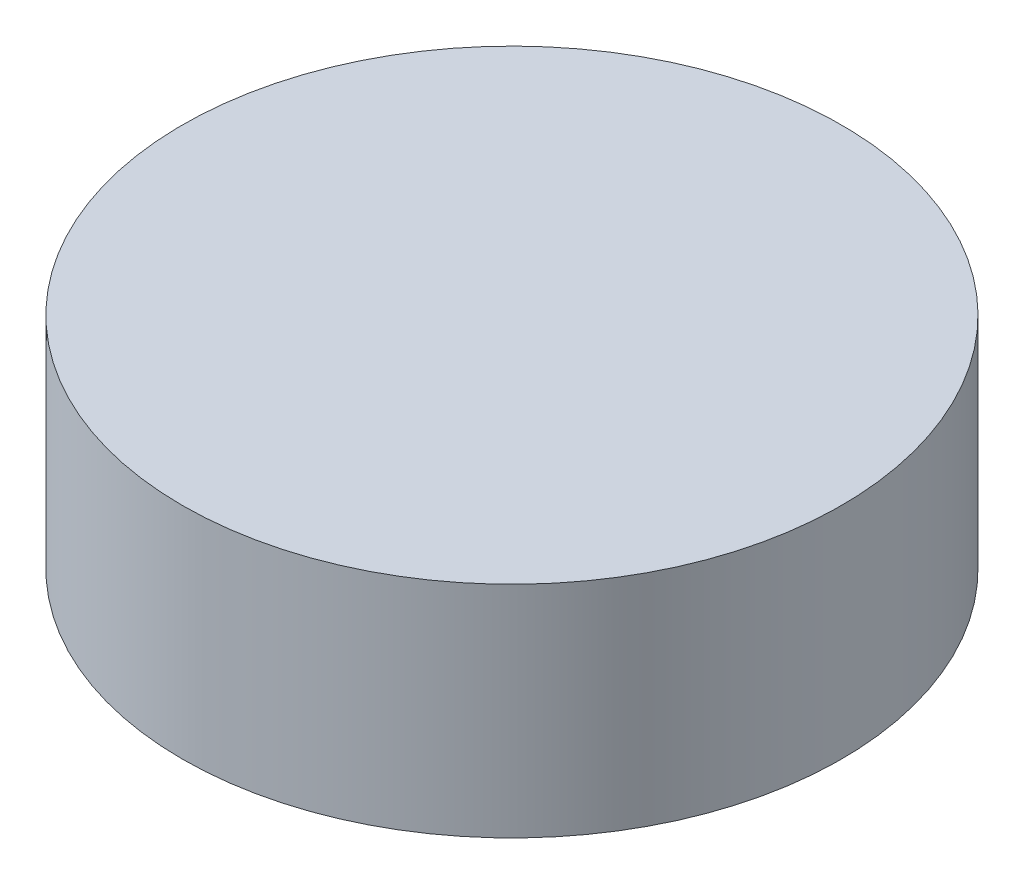
ISO-10303-21;
HEADER;
FILE_DESCRIPTION(('STEP AP214'),'2;1');
FILE_NAME('part.step','',(''),(''),'','','');
FILE_SCHEMA(('AUTOMOTIVE_DESIGN { 1 0 10303 214 1 1 1 1 }'));
ENDSEC;
DATA;
#1=APPLICATION_CONTEXT('core data for automotive mechanical design processes');
#2=APPLICATION_PROTOCOL_DEFINITION('international standard','automotive_design',2000,#1);
#3=PRODUCT_CONTEXT('',#1,'mechanical');
#4=PRODUCT('Part','Part','',(#3));
#5=PRODUCT_RELATED_PRODUCT_CATEGORY('part','',(#4));
#6=PRODUCT_DEFINITION_FORMATION('','',#4);
#7=PRODUCT_DEFINITION_CONTEXT('part definition',#1,'design');
#8=PRODUCT_DEFINITION('design','',#6,#7);
#9=PRODUCT_DEFINITION_SHAPE('','',#8);
#10=(LENGTH_UNIT() NAMED_UNIT(*) SI_UNIT(.MILLI.,.METRE.));
#11=(NAMED_UNIT(*) PLANE_ANGLE_UNIT() SI_UNIT($,.RADIAN.));
#12=(NAMED_UNIT(*) SI_UNIT($,.STERADIAN.) SOLID_ANGLE_UNIT());
#13=UNCERTAINTY_MEASURE_WITH_UNIT(LENGTH_MEASURE(1.E-05),#10,'distance_accuracy_value','');
#14=(GEOMETRIC_REPRESENTATION_CONTEXT(3) GLOBAL_UNCERTAINTY_ASSIGNED_CONTEXT((#13)) GLOBAL_UNIT_ASSIGNED_CONTEXT((#10,
#11,#12)) REPRESENTATION_CONTEXT('',''));
#15=CARTESIAN_POINT('',(0.,0.,0.));
#16=DIRECTION('',(0.,0.,1.));
#17=DIRECTION('',(1.,0.,0.));
#18=AXIS2_PLACEMENT_3D('',#15,#16,#17);
#19=CARTESIAN_POINT('',(0.,40.,0.));
#20=DIRECTION('',(0.,-1.,0.));
#21=DIRECTION('',(0.,0.,-1.));
#22=AXIS2_PLACEMENT_3D('',#19,#20,#21);
#23=CYLINDRICAL_SURFACE('',#22,60.);
#24=CARTESIAN_POINT('',(0.,40.,0.));
#25=DIRECTION('',(0.,1.,0.));
#26=DIRECTION('',(0.,0.,1.));
#27=AXIS2_PLACEMENT_3D('',#24,#25,#26);
#28=CIRCLE('',#27,60.);
#29=CARTESIAN_POINT('',(0.,40.,60.));
#30=VERTEX_POINT('',#29);
#31=EDGE_CURVE('E10',#30,#30,#28,.T.);
#32=ORIENTED_EDGE('',*,*,#31,.F.);
#33=EDGE_LOOP('',(#32));
#34=FACE_BOUND('',#33,.T.);
#35=CARTESIAN_POINT('',(0.,0.,0.));
#36=DIRECTION('',(0.,1.,0.));
#37=DIRECTION('',(0.,0.,1.));
#38=AXIS2_PLACEMENT_3D('',#35,#36,#37);
#39=CIRCLE('',#38,60.);
#40=CARTESIAN_POINT('',(0.,0.,60.));
#41=VERTEX_POINT('',#40);
#42=EDGE_CURVE('E40',#41,#41,#39,.T.);
#43=ORIENTED_EDGE('',*,*,#42,.T.);
#44=EDGE_LOOP('',(#43));
#45=FACE_BOUND('',#44,.T.);
#46=ADVANCED_FACE('F37',(#34,#45),#23,.T.);
#47=CARTESIAN_POINT('',(0.,40.,0.));
#48=DIRECTION('',(0.,1.,0.));
#49=DIRECTION('',(0.,0.,1.));
#50=AXIS2_PLACEMENT_3D('',#47,#48,#49);
#51=PLANE('',#50);
#52=ORIENTED_EDGE('',*,*,#31,.T.);
#53=EDGE_LOOP('',(#52));
#54=FACE_BOUND('',#53,.T.);
#55=ADVANCED_FACE('F54',(#54),#51,.T.);
#56=CARTESIAN_POINT('',(0.,0.,0.));
#57=DIRECTION('',(0.,1.,0.));
#58=DIRECTION('',(0.,0.,1.));
#59=AXIS2_PLACEMENT_3D('',#56,#57,#58);
#60=PLANE('',#59);
#61=ORIENTED_EDGE('',*,*,#42,.F.);
#62=EDGE_LOOP('',(#61));
#63=FACE_BOUND('',#62,.T.);
#64=ADVANCED_FACE('F52',(#63),#60,.F.);
#65=CLOSED_SHELL('',(#46,#55,#64));
#66=MANIFOLD_SOLID_BREP('B2',#65);
#67=ADVANCED_BREP_SHAPE_REPRESENTATION('',(#18,#66),#14);
#68=SHAPE_DEFINITION_REPRESENTATION(#9,#67);
ENDSEC;
END-ISO-10303-21;
